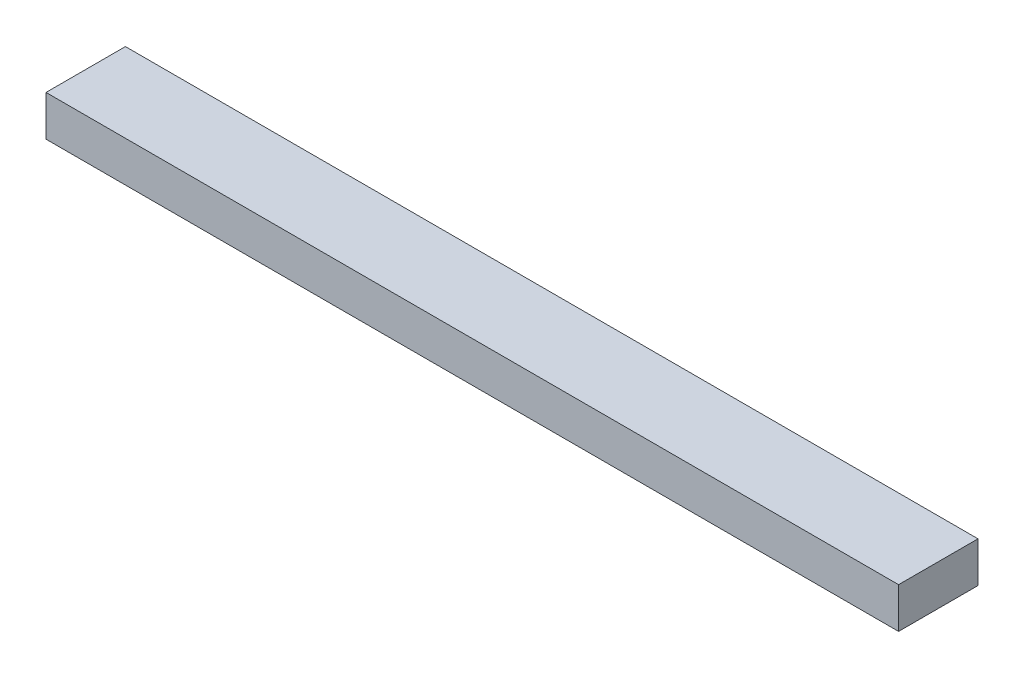
ISO-10303-21;
HEADER;
FILE_DESCRIPTION(('STEP AP214'),'2;1');
FILE_NAME('part.step','',(''),(''),'','','');
FILE_SCHEMA(('AUTOMOTIVE_DESIGN { 1 0 10303 214 1 1 1 1 }'));
ENDSEC;
DATA;
#1=APPLICATION_CONTEXT('core data for automotive mechanical design processes');
#2=APPLICATION_PROTOCOL_DEFINITION('international standard','automotive_design',2000,#1);
#3=PRODUCT_CONTEXT('',#1,'mechanical');
#4=PRODUCT('Part','Part','',(#3));
#5=PRODUCT_RELATED_PRODUCT_CATEGORY('part','',(#4));
#6=PRODUCT_DEFINITION_FORMATION('','',#4);
#7=PRODUCT_DEFINITION_CONTEXT('part definition',#1,'design');
#8=PRODUCT_DEFINITION('design','',#6,#7);
#9=PRODUCT_DEFINITION_SHAPE('','',#8);
#10=(LENGTH_UNIT() NAMED_UNIT(*) SI_UNIT(.MILLI.,.METRE.));
#11=(NAMED_UNIT(*) PLANE_ANGLE_UNIT() SI_UNIT($,.RADIAN.));
#12=(NAMED_UNIT(*) SI_UNIT($,.STERADIAN.) SOLID_ANGLE_UNIT());
#13=UNCERTAINTY_MEASURE_WITH_UNIT(LENGTH_MEASURE(1.E-05),#10,'distance_accuracy_value','');
#14=(GEOMETRIC_REPRESENTATION_CONTEXT(3) GLOBAL_UNCERTAINTY_ASSIGNED_CONTEXT((#13)) GLOBAL_UNIT_ASSIGNED_CONTEXT((#10,
#11,#12)) REPRESENTATION_CONTEXT('',''));
#15=CARTESIAN_POINT('',(0.,0.,0.));
#16=DIRECTION('',(0.,0.,1.));
#17=DIRECTION('',(1.,0.,0.));
#18=AXIS2_PLACEMENT_3D('',#15,#16,#17);
#19=CARTESIAN_POINT('',(0.,0.,0.));
#20=DIRECTION('',(0.,0.,1.));
#21=DIRECTION('',(1.,0.,0.));
#22=AXIS2_PLACEMENT_3D('',#19,#20,#21);
#23=PLANE('',#22);
#24=DIRECTION('',(0.,-1.,0.));
#25=VECTOR('',#24,1.);
#26=CARTESIAN_POINT('',(184.065660481465,-25.282992430741,0.));
#27=LINE('',#26,#25);
#28=CARTESIAN_POINT('',(184.065660481465,-25.282992430741,0.));
#29=VERTEX_POINT('',#28);
#30=CARTESIAN_POINT('',(184.065660481465,-37.9829924307409,0.));
#31=VERTEX_POINT('',#30);
#32=EDGE_CURVE('E89',#29,#31,#27,.T.);
#33=ORIENTED_EDGE('',*,*,#32,.F.);
#34=DIRECTION('',(-1.,0.,0.));
#35=VECTOR('',#34,1.);
#36=CARTESIAN_POINT('',(184.065660481465,-25.282992430741,0.));
#37=LINE('',#36,#35);
#38=CARTESIAN_POINT('',(451.365660481464,-25.282992430741,0.));
#39=VERTEX_POINT('',#38);
#40=EDGE_CURVE('E100',#39,#29,#37,.T.);
#41=ORIENTED_EDGE('',*,*,#40,.F.);
#42=DIRECTION('',(0.,1.,0.));
#43=VECTOR('',#42,1.);
#44=CARTESIAN_POINT('',(451.365660481464,-25.282992430741,0.));
#45=LINE('',#44,#43);
#46=CARTESIAN_POINT('',(451.365660481464,-37.982992430741,0.));
#47=VERTEX_POINT('',#46);
#48=EDGE_CURVE('E91',#47,#39,#45,.T.);
#49=ORIENTED_EDGE('',*,*,#48,.F.);
#50=DIRECTION('',(1.,0.,0.));
#51=VECTOR('',#50,1.);
#52=CARTESIAN_POINT('',(184.065660481465,-37.9829924307409,0.));
#53=LINE('',#52,#51);
#54=EDGE_CURVE('E81',#31,#47,#53,.T.);
#55=ORIENTED_EDGE('',*,*,#54,.F.);
#56=EDGE_LOOP('',(#33,#41,#49,#55));
#57=FACE_BOUND('',#56,.T.);
#58=ADVANCED_FACE('F39',(#57),#23,.F.);
#59=CARTESIAN_POINT('',(184.065660481465,-25.282992430741,292.501532133133));
#60=DIRECTION('',(0.,-1.,0.));
#61=DIRECTION('',(1.,0.,0.));
#62=AXIS2_PLACEMENT_3D('',#59,#60,#61);
#63=PLANE('',#62);
#64=DIRECTION('',(0.,0.,-1.));
#65=VECTOR('',#64,1.);
#66=CARTESIAN_POINT('',(184.065660481465,-25.282992430741,292.501532133133));
#67=LINE('',#66,#65);
#68=CARTESIAN_POINT('',(184.065660481465,-25.282992430741,24.9000000000004));
#69=VERTEX_POINT('',#68);
#70=EDGE_CURVE('E94',#69,#29,#67,.T.);
#71=ORIENTED_EDGE('',*,*,#70,.F.);
#72=DIRECTION('',(1.,0.,0.));
#73=VECTOR('',#72,1.);
#74=CARTESIAN_POINT('',(184.065660481465,-25.282992430741,24.9000000000004));
#75=LINE('',#74,#73);
#76=CARTESIAN_POINT('',(451.365660481464,-25.282992430741,24.9000000000004));
#77=VERTEX_POINT('',#76);
#78=EDGE_CURVE('E43',#69,#77,#75,.T.);
#79=ORIENTED_EDGE('',*,*,#78,.T.);
#80=DIRECTION('',(0.,0.,-1.));
#81=VECTOR('',#80,1.);
#82=CARTESIAN_POINT('',(451.365660481464,-25.282992430741,292.501532133133));
#83=LINE('',#82,#81);
#84=EDGE_CURVE('E103',#77,#39,#83,.T.);
#85=ORIENTED_EDGE('',*,*,#84,.T.);
#86=ORIENTED_EDGE('',*,*,#40,.T.);
#87=EDGE_LOOP('',(#71,#79,#85,#86));
#88=FACE_BOUND('',#87,.T.);
#89=ADVANCED_FACE('F112',(#88),#63,.F.);
#90=CARTESIAN_POINT('',(451.365660481464,-25.282992430741,292.501532133133));
#91=DIRECTION('',(-1.,0.,0.));
#92=DIRECTION('',(0.,0.,1.));
#93=AXIS2_PLACEMENT_3D('',#90,#91,#92);
#94=PLANE('',#93);
#95=ORIENTED_EDGE('',*,*,#84,.F.);
#96=DIRECTION('',(0.,-1.,0.));
#97=VECTOR('',#96,1.);
#98=CARTESIAN_POINT('',(451.365660481464,-25.282992430741,24.9000000000004));
#99=LINE('',#98,#97);
#100=CARTESIAN_POINT('',(451.365660481464,-37.982992430741,24.9000000000004));
#101=VERTEX_POINT('',#100);
#102=EDGE_CURVE('E109',#77,#101,#99,.T.);
#103=ORIENTED_EDGE('',*,*,#102,.T.);
#104=DIRECTION('',(0.,0.,-1.));
#105=VECTOR('',#104,1.);
#106=CARTESIAN_POINT('',(451.365660481464,-37.982992430741,292.501532133133));
#107=LINE('',#106,#105);
#108=EDGE_CURVE('E85',#101,#47,#107,.T.);
#109=ORIENTED_EDGE('',*,*,#108,.T.);
#110=ORIENTED_EDGE('',*,*,#48,.T.);
#111=EDGE_LOOP('',(#95,#103,#109,#110));
#112=FACE_BOUND('',#111,.T.);
#113=ADVANCED_FACE('F108',(#112),#94,.F.);
#114=CARTESIAN_POINT('',(184.065660481465,-37.9829924307409,292.501532133133));
#115=DIRECTION('',(0.,1.,0.));
#116=DIRECTION('',(-1.,0.,0.));
#117=AXIS2_PLACEMENT_3D('',#114,#115,#116);
#118=PLANE('',#117);
#119=ORIENTED_EDGE('',*,*,#108,.F.);
#120=DIRECTION('',(-1.,0.,0.));
#121=VECTOR('',#120,1.);
#122=CARTESIAN_POINT('',(184.065660481465,-37.9829924307409,24.9000000000004));
#123=LINE('',#122,#121);
#124=CARTESIAN_POINT('',(184.065660481465,-37.9829924307409,24.9000000000004));
#125=VERTEX_POINT('',#124);
#126=EDGE_CURVE('E48',#101,#125,#123,.T.);
#127=ORIENTED_EDGE('',*,*,#126,.T.);
#128=DIRECTION('',(0.,0.,-1.));
#129=VECTOR('',#128,1.);
#130=CARTESIAN_POINT('',(184.065660481465,-37.9829924307409,292.501532133133));
#131=LINE('',#130,#129);
#132=EDGE_CURVE('E78',#125,#31,#131,.T.);
#133=ORIENTED_EDGE('',*,*,#132,.T.);
#134=ORIENTED_EDGE('',*,*,#54,.T.);
#135=EDGE_LOOP('',(#119,#127,#133,#134));
#136=FACE_BOUND('',#135,.T.);
#137=ADVANCED_FACE('F80',(#136),#118,.F.);
#138=CARTESIAN_POINT('',(184.065660481465,-25.282992430741,292.501532133133));
#139=DIRECTION('',(1.,0.,0.));
#140=DIRECTION('',(0.,1.,0.));
#141=AXIS2_PLACEMENT_3D('',#138,#139,#140);
#142=PLANE('',#141);
#143=ORIENTED_EDGE('',*,*,#132,.F.);
#144=DIRECTION('',(0.,1.,0.));
#145=VECTOR('',#144,1.);
#146=CARTESIAN_POINT('',(184.065660481465,-25.282992430741,24.9000000000004));
#147=LINE('',#146,#145);
#148=EDGE_CURVE('E11',#125,#69,#147,.T.);
#149=ORIENTED_EDGE('',*,*,#148,.T.);
#150=ORIENTED_EDGE('',*,*,#70,.T.);
#151=ORIENTED_EDGE('',*,*,#32,.T.);
#152=EDGE_LOOP('',(#143,#149,#150,#151));
#153=FACE_BOUND('',#152,.T.);
#154=ADVANCED_FACE('F41',(#153),#142,.F.);
#155=CARTESIAN_POINT('',(-30.9343395185352,-30.9829924307413,24.9000000000004));
#156=DIRECTION('',(0.,0.,-1.));
#157=DIRECTION('',(-1.,0.,0.));
#158=AXIS2_PLACEMENT_3D('',#155,#156,#157);
#159=PLANE('',#158);
#160=ORIENTED_EDGE('',*,*,#126,.F.);
#161=ORIENTED_EDGE('',*,*,#102,.F.);
#162=ORIENTED_EDGE('',*,*,#78,.F.);
#163=ORIENTED_EDGE('',*,*,#148,.F.);
#164=EDGE_LOOP('',(#160,#161,#162,#163));
#165=FACE_BOUND('',#164,.T.);
#166=ADVANCED_FACE('F126',(#165),#159,.F.);
#167=CLOSED_SHELL('',(#58,#89,#113,#137,#154,#166));
#168=MANIFOLD_SOLID_BREP('B2',#167);
#169=ADVANCED_BREP_SHAPE_REPRESENTATION('',(#18,#168),#14);
#170=SHAPE_DEFINITION_REPRESENTATION(#9,#169);
ENDSEC;
END-ISO-10303-21;
